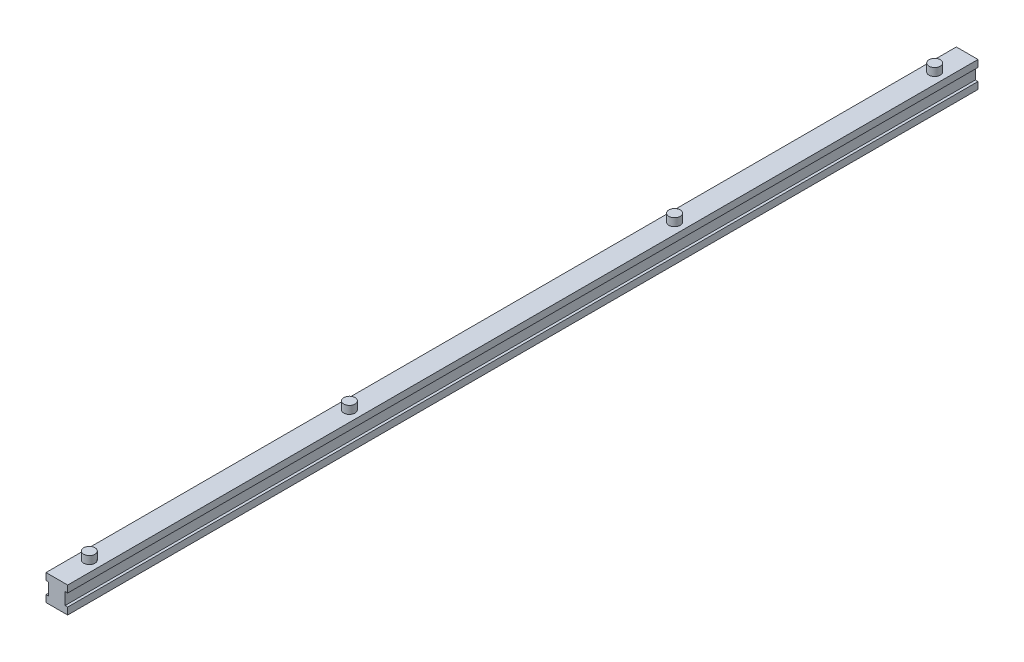
ISO-10303-21;
HEADER;
FILE_DESCRIPTION(('STEP AP214'),'2;1');
FILE_NAME('part.step','',(''),(''),'','','');
FILE_SCHEMA(('AUTOMOTIVE_DESIGN { 1 0 10303 214 1 1 1 1 }'));
ENDSEC;
DATA;
#1=APPLICATION_CONTEXT('core data for automotive mechanical design processes');
#2=APPLICATION_PROTOCOL_DEFINITION('international standard','automotive_design',2000,#1);
#3=PRODUCT_CONTEXT('',#1,'mechanical');
#4=PRODUCT('Part','Part','',(#3));
#5=PRODUCT_RELATED_PRODUCT_CATEGORY('part','',(#4));
#6=PRODUCT_DEFINITION_FORMATION('','',#4);
#7=PRODUCT_DEFINITION_CONTEXT('part definition',#1,'design');
#8=PRODUCT_DEFINITION('design','',#6,#7);
#9=PRODUCT_DEFINITION_SHAPE('','',#8);
#10=(LENGTH_UNIT() NAMED_UNIT(*) SI_UNIT(.MILLI.,.METRE.));
#11=(NAMED_UNIT(*) PLANE_ANGLE_UNIT() SI_UNIT($,.RADIAN.));
#12=(NAMED_UNIT(*) SI_UNIT($,.STERADIAN.) SOLID_ANGLE_UNIT());
#13=UNCERTAINTY_MEASURE_WITH_UNIT(LENGTH_MEASURE(1.E-05),#10,'distance_accuracy_value','');
#14=(GEOMETRIC_REPRESENTATION_CONTEXT(3) GLOBAL_UNCERTAINTY_ASSIGNED_CONTEXT((#13)) GLOBAL_UNIT_ASSIGNED_CONTEXT((#10,
#11,#12)) REPRESENTATION_CONTEXT('',''));
#15=CARTESIAN_POINT('',(0.,0.,0.));
#16=DIRECTION('',(0.,0.,1.));
#17=DIRECTION('',(1.,0.,0.));
#18=AXIS2_PLACEMENT_3D('',#15,#16,#17);
#19=CARTESIAN_POINT('',(0.,0.8,0.));
#20=DIRECTION('',(0.,1.,0.));
#21=DIRECTION('',(0.,0.,1.));
#22=AXIS2_PLACEMENT_3D('',#19,#20,#21);
#23=PLANE('',#22);
#24=DIRECTION('',(0.,0.,1.));
#25=VECTOR('',#24,1.);
#26=CARTESIAN_POINT('',(-0.95,0.8,52.5));
#27=LINE('',#26,#25);
#28=CARTESIAN_POINT('',(-0.95,0.8,-52.5));
#29=VERTEX_POINT('',#28);
#30=CARTESIAN_POINT('',(-0.95,0.8,52.5));
#31=VERTEX_POINT('',#30);
#32=EDGE_CURVE('E48',#29,#31,#27,.T.);
#33=ORIENTED_EDGE('',*,*,#32,.F.);
#34=DIRECTION('',(-1.,0.,0.));
#35=VECTOR('',#34,1.);
#36=CARTESIAN_POINT('',(1.25,0.8,-52.5));
#37=LINE('',#36,#35);
#38=CARTESIAN_POINT('',(-1.25,0.8,-52.5));
#39=VERTEX_POINT('',#38);
#40=EDGE_CURVE('E182',#29,#39,#37,.T.);
#41=ORIENTED_EDGE('',*,*,#40,.T.);
#42=DIRECTION('',(0.,0.,1.));
#43=VECTOR('',#42,1.);
#44=CARTESIAN_POINT('',(-1.25,0.8,52.5));
#45=LINE('',#44,#43);
#46=CARTESIAN_POINT('',(-1.25,0.8,52.5));
#47=VERTEX_POINT('',#46);
#48=EDGE_CURVE('E173',#39,#47,#45,.T.);
#49=ORIENTED_EDGE('',*,*,#48,.T.);
#50=DIRECTION('',(1.,0.,0.));
#51=VECTOR('',#50,1.);
#52=CARTESIAN_POINT('',(1.25,0.8,52.5));
#53=LINE('',#52,#51);
#54=EDGE_CURVE('E178',#47,#31,#53,.T.);
#55=ORIENTED_EDGE('',*,*,#54,.T.);
#56=EDGE_LOOP('',(#33,#41,#49,#55));
#57=FACE_BOUND('',#56,.T.);
#58=ADVANCED_FACE('F33',(#57),#23,.T.);
#59=CARTESIAN_POINT('',(-1.25,0.8,52.5));
#60=DIRECTION('',(1.,0.,0.));
#61=DIRECTION('',(0.,0.,-1.));
#62=AXIS2_PLACEMENT_3D('',#59,#60,#61);
#63=PLANE('',#62);
#64=DIRECTION('',(0.,0.,1.));
#65=VECTOR('',#64,1.);
#66=CARTESIAN_POINT('',(-1.25,0.,52.5));
#67=LINE('',#66,#65);
#68=CARTESIAN_POINT('',(-1.25,0.,-52.5));
#69=VERTEX_POINT('',#68);
#70=CARTESIAN_POINT('',(-1.25,0.,52.5));
#71=VERTEX_POINT('',#70);
#72=EDGE_CURVE('E172',#69,#71,#67,.T.);
#73=ORIENTED_EDGE('',*,*,#72,.T.);
#74=DIRECTION('',(0.,-1.,0.));
#75=VECTOR('',#74,1.);
#76=CARTESIAN_POINT('',(-1.25,0.8,52.5));
#77=LINE('',#76,#75);
#78=EDGE_CURVE('E11',#47,#71,#77,.T.);
#79=ORIENTED_EDGE('',*,*,#78,.F.);
#80=ORIENTED_EDGE('',*,*,#48,.F.);
#81=DIRECTION('',(0.,-1.,0.));
#82=VECTOR('',#81,1.);
#83=CARTESIAN_POINT('',(-1.25,0.8,-52.5));
#84=LINE('',#83,#82);
#85=EDGE_CURVE('E185',#39,#69,#84,.T.);
#86=ORIENTED_EDGE('',*,*,#85,.T.);
#87=EDGE_LOOP('',(#73,#79,#80,#86));
#88=FACE_BOUND('',#87,.T.);
#89=ADVANCED_FACE('F35',(#88),#63,.F.);
#90=CARTESIAN_POINT('',(1.25,0.8,52.5));
#91=DIRECTION('',(0.,0.,-1.));
#92=DIRECTION('',(-1.,0.,0.));
#93=AXIS2_PLACEMENT_3D('',#90,#91,#92);
#94=PLANE('',#93);
#95=DIRECTION('',(1.,0.,0.));
#96=VECTOR('',#95,1.);
#97=CARTESIAN_POINT('',(1.25,0.,52.5));
#98=LINE('',#97,#96);
#99=CARTESIAN_POINT('',(1.25,0.,52.5));
#100=VERTEX_POINT('',#99);
#101=EDGE_CURVE('E188',#71,#100,#98,.T.);
#102=ORIENTED_EDGE('',*,*,#101,.T.);
#103=DIRECTION('',(0.,-1.,0.));
#104=VECTOR('',#103,1.);
#105=CARTESIAN_POINT('',(1.25,0.8,52.5));
#106=LINE('',#105,#104);
#107=CARTESIAN_POINT('',(1.25,0.8,52.5));
#108=VERTEX_POINT('',#107);
#109=EDGE_CURVE('E41',#108,#100,#106,.T.);
#110=ORIENTED_EDGE('',*,*,#109,.F.);
#111=CARTESIAN_POINT('',(0.95,0.8,52.5));
#112=VERTEX_POINT('',#111);
#113=EDGE_CURVE('E176',#112,#108,#53,.T.);
#114=ORIENTED_EDGE('',*,*,#113,.F.);
#115=DIRECTION('',(0.,-1.,0.));
#116=VECTOR('',#115,1.);
#117=CARTESIAN_POINT('',(0.95,2.2,52.5));
#118=LINE('',#117,#116);
#119=CARTESIAN_POINT('',(0.95,2.2,52.5));
#120=VERTEX_POINT('',#119);
#121=EDGE_CURVE('E166',#120,#112,#118,.T.);
#122=ORIENTED_EDGE('',*,*,#121,.F.);
#123=DIRECTION('',(1.,0.,0.));
#124=VECTOR('',#123,1.);
#125=CARTESIAN_POINT('',(-1.25,2.2,52.5));
#126=LINE('',#125,#124);
#127=CARTESIAN_POINT('',(1.25,2.2,52.5));
#128=VERTEX_POINT('',#127);
#129=EDGE_CURVE('E145',#120,#128,#126,.T.);
#130=ORIENTED_EDGE('',*,*,#129,.T.);
#131=DIRECTION('',(0.,-1.,0.));
#132=VECTOR('',#131,1.);
#133=CARTESIAN_POINT('',(1.25,3.,52.5));
#134=LINE('',#133,#132);
#135=CARTESIAN_POINT('',(1.25,3.,52.5));
#136=VERTEX_POINT('',#135);
#137=EDGE_CURVE('E126',#136,#128,#134,.T.);
#138=ORIENTED_EDGE('',*,*,#137,.F.);
#139=DIRECTION('',(1.,0.,0.));
#140=VECTOR('',#139,1.);
#141=CARTESIAN_POINT('',(-1.25,3.,52.5));
#142=LINE('',#141,#140);
#143=CARTESIAN_POINT('',(-1.25,3.,52.5));
#144=VERTEX_POINT('',#143);
#145=EDGE_CURVE('E132',#144,#136,#142,.T.);
#146=ORIENTED_EDGE('',*,*,#145,.F.);
#147=DIRECTION('',(0.,-1.,0.));
#148=VECTOR('',#147,1.);
#149=CARTESIAN_POINT('',(-1.25,3.,52.5));
#150=LINE('',#149,#148);
#151=CARTESIAN_POINT('',(-1.25,2.2,52.5));
#152=VERTEX_POINT('',#151);
#153=EDGE_CURVE('E236',#144,#152,#150,.T.);
#154=ORIENTED_EDGE('',*,*,#153,.T.);
#155=CARTESIAN_POINT('',(-0.95,2.2,52.5));
#156=VERTEX_POINT('',#155);
#157=EDGE_CURVE('E231',#152,#156,#126,.T.);
#158=ORIENTED_EDGE('',*,*,#157,.T.);
#159=DIRECTION('',(0.,-1.,0.));
#160=VECTOR('',#159,1.);
#161=CARTESIAN_POINT('',(-0.95,2.2,52.5));
#162=LINE('',#161,#160);
#163=EDGE_CURVE('E169',#156,#31,#162,.T.);
#164=ORIENTED_EDGE('',*,*,#163,.T.);
#165=ORIENTED_EDGE('',*,*,#54,.F.);
#166=ORIENTED_EDGE('',*,*,#78,.T.);
#167=EDGE_LOOP('',(#102,#110,#114,#122,#130,#138,#146,#154,#158,#164,#165,#166));
#168=FACE_BOUND('',#167,.T.);
#169=ADVANCED_FACE('F143',(#168),#94,.F.);
#170=CARTESIAN_POINT('',(1.25,0.8,52.5));
#171=DIRECTION('',(-1.,0.,0.));
#172=DIRECTION('',(0.,0.,1.));
#173=AXIS2_PLACEMENT_3D('',#170,#171,#172);
#174=PLANE('',#173);
#175=DIRECTION('',(0.,0.,-1.));
#176=VECTOR('',#175,1.);
#177=CARTESIAN_POINT('',(1.25,0.,52.5));
#178=LINE('',#177,#176);
#179=CARTESIAN_POINT('',(1.25,0.,-52.5));
#180=VERTEX_POINT('',#179);
#181=EDGE_CURVE('E190',#100,#180,#178,.T.);
#182=ORIENTED_EDGE('',*,*,#181,.T.);
#183=DIRECTION('',(0.,-1.,0.));
#184=VECTOR('',#183,1.);
#185=CARTESIAN_POINT('',(1.25,0.8,-52.5));
#186=LINE('',#185,#184);
#187=CARTESIAN_POINT('',(1.25,0.8,-52.5));
#188=VERTEX_POINT('',#187);
#189=EDGE_CURVE('E195',#188,#180,#186,.T.);
#190=ORIENTED_EDGE('',*,*,#189,.F.);
#191=DIRECTION('',(0.,0.,-1.));
#192=VECTOR('',#191,1.);
#193=CARTESIAN_POINT('',(1.25,0.8,52.5));
#194=LINE('',#193,#192);
#195=EDGE_CURVE('E180',#108,#188,#194,.T.);
#196=ORIENTED_EDGE('',*,*,#195,.F.);
#197=ORIENTED_EDGE('',*,*,#109,.T.);
#198=EDGE_LOOP('',(#182,#190,#196,#197));
#199=FACE_BOUND('',#198,.T.);
#200=ADVANCED_FACE('F202',(#199),#174,.F.);
#201=CARTESIAN_POINT('',(1.25,0.8,-52.5));
#202=DIRECTION('',(0.,0.,1.));
#203=DIRECTION('',(1.,0.,0.));
#204=AXIS2_PLACEMENT_3D('',#201,#202,#203);
#205=PLANE('',#204);
#206=DIRECTION('',(-1.,0.,0.));
#207=VECTOR('',#206,1.);
#208=CARTESIAN_POINT('',(1.25,0.,-52.5));
#209=LINE('',#208,#207);
#210=EDGE_CURVE('E177',#180,#69,#209,.T.);
#211=ORIENTED_EDGE('',*,*,#210,.T.);
#212=ORIENTED_EDGE('',*,*,#85,.F.);
#213=ORIENTED_EDGE('',*,*,#40,.F.);
#214=DIRECTION('',(0.,-1.,0.));
#215=VECTOR('',#214,1.);
#216=CARTESIAN_POINT('',(-0.95,2.2,-52.5));
#217=LINE('',#216,#215);
#218=CARTESIAN_POINT('',(-0.95,2.2,-52.5));
#219=VERTEX_POINT('',#218);
#220=EDGE_CURVE('E158',#219,#29,#217,.T.);
#221=ORIENTED_EDGE('',*,*,#220,.F.);
#222=DIRECTION('',(-1.,0.,0.));
#223=VECTOR('',#222,1.);
#224=CARTESIAN_POINT('',(1.25,2.2,-52.5));
#225=LINE('',#224,#223);
#226=CARTESIAN_POINT('',(-1.25,2.2,-52.5));
#227=VERTEX_POINT('',#226);
#228=EDGE_CURVE('E223',#219,#227,#225,.T.);
#229=ORIENTED_EDGE('',*,*,#228,.T.);
#230=DIRECTION('',(0.,-1.,0.));
#231=VECTOR('',#230,1.);
#232=CARTESIAN_POINT('',(-1.25,3.,-52.5));
#233=LINE('',#232,#231);
#234=CARTESIAN_POINT('',(-1.25,3.,-52.5));
#235=VERTEX_POINT('',#234);
#236=EDGE_CURVE('E149',#235,#227,#233,.T.);
#237=ORIENTED_EDGE('',*,*,#236,.F.);
#238=DIRECTION('',(-1.,0.,0.));
#239=VECTOR('',#238,1.);
#240=CARTESIAN_POINT('',(1.25,3.,-52.5));
#241=LINE('',#240,#239);
#242=CARTESIAN_POINT('',(1.25,3.,-52.5));
#243=VERTEX_POINT('',#242);
#244=EDGE_CURVE('E131',#243,#235,#241,.T.);
#245=ORIENTED_EDGE('',*,*,#244,.F.);
#246=DIRECTION('',(0.,-1.,0.));
#247=VECTOR('',#246,1.);
#248=CARTESIAN_POINT('',(1.25,3.,-52.5));
#249=LINE('',#248,#247);
#250=CARTESIAN_POINT('',(1.25,2.2,-52.5));
#251=VERTEX_POINT('',#250);
#252=EDGE_CURVE('E128',#243,#251,#249,.T.);
#253=ORIENTED_EDGE('',*,*,#252,.T.);
#254=CARTESIAN_POINT('',(0.95,2.2,-52.5));
#255=VERTEX_POINT('',#254);
#256=EDGE_CURVE('E227',#251,#255,#225,.T.);
#257=ORIENTED_EDGE('',*,*,#256,.T.);
#258=DIRECTION('',(0.,-1.,0.));
#259=VECTOR('',#258,1.);
#260=CARTESIAN_POINT('',(0.95,2.2,-52.5));
#261=LINE('',#260,#259);
#262=CARTESIAN_POINT('',(0.95,0.8,-52.5));
#263=VERTEX_POINT('',#262);
#264=EDGE_CURVE('E163',#255,#263,#261,.T.);
#265=ORIENTED_EDGE('',*,*,#264,.T.);
#266=EDGE_CURVE('E183',#188,#263,#37,.T.);
#267=ORIENTED_EDGE('',*,*,#266,.F.);
#268=ORIENTED_EDGE('',*,*,#189,.T.);
#269=EDGE_LOOP('',(#211,#212,#213,#221,#229,#237,#245,#253,#257,#265,#267,#268));
#270=FACE_BOUND('',#269,.T.);
#271=ADVANCED_FACE('F210',(#270),#205,.F.);
#272=DIRECTION('',(0.,0.,-1.));
#273=VECTOR('',#272,1.);
#274=CARTESIAN_POINT('',(0.95,0.8,52.5));
#275=LINE('',#274,#273);
#276=EDGE_CURVE('E56',#112,#263,#275,.T.);
#277=ORIENTED_EDGE('',*,*,#276,.F.);
#278=ORIENTED_EDGE('',*,*,#113,.T.);
#279=ORIENTED_EDGE('',*,*,#195,.T.);
#280=ORIENTED_EDGE('',*,*,#266,.T.);
#281=EDGE_LOOP('',(#277,#278,#279,#280));
#282=FACE_BOUND('',#281,.T.);
#283=ADVANCED_FACE('F300',(#282),#23,.T.);
#284=CARTESIAN_POINT('',(0.,0.,0.));
#285=DIRECTION('',(0.,1.,0.));
#286=DIRECTION('',(0.,0.,1.));
#287=AXIS2_PLACEMENT_3D('',#284,#285,#286);
#288=PLANE('',#287);
#289=ORIENTED_EDGE('',*,*,#72,.F.);
#290=ORIENTED_EDGE('',*,*,#210,.F.);
#291=ORIENTED_EDGE('',*,*,#181,.F.);
#292=ORIENTED_EDGE('',*,*,#101,.F.);
#293=EDGE_LOOP('',(#289,#290,#291,#292));
#294=FACE_BOUND('',#293,.T.);
#295=ADVANCED_FACE('F207',(#294),#288,.F.);
#296=CARTESIAN_POINT('',(-0.95,2.2,52.5));
#297=DIRECTION('',(1.,0.,0.));
#298=DIRECTION('',(0.,0.,-1.));
#299=AXIS2_PLACEMENT_3D('',#296,#297,#298);
#300=PLANE('',#299);
#301=ORIENTED_EDGE('',*,*,#32,.T.);
#302=ORIENTED_EDGE('',*,*,#163,.F.);
#303=DIRECTION('',(0.,0.,1.));
#304=VECTOR('',#303,1.);
#305=CARTESIAN_POINT('',(-0.95,2.2,52.5));
#306=LINE('',#305,#304);
#307=EDGE_CURVE('E153',#219,#156,#306,.T.);
#308=ORIENTED_EDGE('',*,*,#307,.F.);
#309=ORIENTED_EDGE('',*,*,#220,.T.);
#310=EDGE_LOOP('',(#301,#302,#308,#309));
#311=FACE_BOUND('',#310,.T.);
#312=ADVANCED_FACE('F217',(#311),#300,.F.);
#313=CARTESIAN_POINT('',(0.95,2.2,52.5));
#314=DIRECTION('',(-1.,0.,0.));
#315=DIRECTION('',(0.,0.,1.));
#316=AXIS2_PLACEMENT_3D('',#313,#314,#315);
#317=PLANE('',#316);
#318=ORIENTED_EDGE('',*,*,#276,.T.);
#319=ORIENTED_EDGE('',*,*,#264,.F.);
#320=DIRECTION('',(0.,0.,-1.));
#321=VECTOR('',#320,1.);
#322=CARTESIAN_POINT('',(0.95,2.2,52.5));
#323=LINE('',#322,#321);
#324=EDGE_CURVE('E156',#120,#255,#323,.T.);
#325=ORIENTED_EDGE('',*,*,#324,.F.);
#326=ORIENTED_EDGE('',*,*,#121,.T.);
#327=EDGE_LOOP('',(#318,#319,#325,#326));
#328=FACE_BOUND('',#327,.T.);
#329=ADVANCED_FACE('F365',(#328),#317,.F.);
#330=CARTESIAN_POINT('',(0.,2.2,0.));
#331=DIRECTION('',(0.,1.,0.));
#332=DIRECTION('',(0.,0.,1.));
#333=AXIS2_PLACEMENT_3D('',#330,#331,#332);
#334=PLANE('',#333);
#335=ORIENTED_EDGE('',*,*,#228,.F.);
#336=ORIENTED_EDGE('',*,*,#307,.T.);
#337=ORIENTED_EDGE('',*,*,#157,.F.);
#338=DIRECTION('',(0.,0.,1.));
#339=VECTOR('',#338,1.);
#340=CARTESIAN_POINT('',(-1.25,2.2,-52.5));
#341=LINE('',#340,#339);
#342=EDGE_CURVE('E141',#227,#152,#341,.T.);
#343=ORIENTED_EDGE('',*,*,#342,.F.);
#344=EDGE_LOOP('',(#335,#336,#337,#343));
#345=FACE_BOUND('',#344,.T.);
#346=ADVANCED_FACE('F224',(#345),#334,.F.);
#347=ORIENTED_EDGE('',*,*,#129,.F.);
#348=ORIENTED_EDGE('',*,*,#324,.T.);
#349=ORIENTED_EDGE('',*,*,#256,.F.);
#350=DIRECTION('',(0.,0.,-1.));
#351=VECTOR('',#350,1.);
#352=CARTESIAN_POINT('',(1.25,2.2,52.5));
#353=LINE('',#352,#351);
#354=EDGE_CURVE('E228',#128,#251,#353,.T.);
#355=ORIENTED_EDGE('',*,*,#354,.F.);
#356=EDGE_LOOP('',(#347,#348,#349,#355));
#357=FACE_BOUND('',#356,.T.);
#358=ADVANCED_FACE('F381',(#357),#334,.F.);
#359=CARTESIAN_POINT('',(1.25,3.,52.5));
#360=DIRECTION('',(-1.,0.,0.));
#361=DIRECTION('',(0.,0.,1.));
#362=AXIS2_PLACEMENT_3D('',#359,#360,#361);
#363=PLANE('',#362);
#364=ORIENTED_EDGE('',*,*,#354,.T.);
#365=ORIENTED_EDGE('',*,*,#252,.F.);
#366=DIRECTION('',(0.,0.,-1.));
#367=VECTOR('',#366,1.);
#368=CARTESIAN_POINT('',(1.25,3.,52.5));
#369=LINE('',#368,#367);
#370=EDGE_CURVE('E122',#136,#243,#369,.T.);
#371=ORIENTED_EDGE('',*,*,#370,.F.);
#372=ORIENTED_EDGE('',*,*,#137,.T.);
#373=EDGE_LOOP('',(#364,#365,#371,#372));
#374=FACE_BOUND('',#373,.T.);
#375=ADVANCED_FACE('F124',(#374),#363,.F.);
#376=CARTESIAN_POINT('',(-1.25,3.,-52.5));
#377=DIRECTION('',(1.,0.,0.));
#378=DIRECTION('',(0.,0.,-1.));
#379=AXIS2_PLACEMENT_3D('',#376,#377,#378);
#380=PLANE('',#379);
#381=ORIENTED_EDGE('',*,*,#342,.T.);
#382=ORIENTED_EDGE('',*,*,#153,.F.);
#383=DIRECTION('',(0.,0.,1.));
#384=VECTOR('',#383,1.);
#385=CARTESIAN_POINT('',(-1.25,3.,-52.5));
#386=LINE('',#385,#384);
#387=EDGE_CURVE('E137',#235,#144,#386,.T.);
#388=ORIENTED_EDGE('',*,*,#387,.F.);
#389=ORIENTED_EDGE('',*,*,#236,.T.);
#390=EDGE_LOOP('',(#381,#382,#388,#389));
#391=FACE_BOUND('',#390,.T.);
#392=ADVANCED_FACE('F238',(#391),#380,.F.);
#393=CARTESIAN_POINT('',(0.,3.,0.));
#394=DIRECTION('',(0.,1.,0.));
#395=DIRECTION('',(0.,0.,1.));
#396=AXIS2_PLACEMENT_3D('',#393,#394,#395);
#397=PLANE('',#396);
#398=CARTESIAN_POINT('',(0.,3.,48.75));
#399=DIRECTION('',(0.,1.,0.));
#400=DIRECTION('',(0.,0.,1.));
#401=AXIS2_PLACEMENT_3D('',#398,#399,#400);
#402=CIRCLE('',#401,0.65);
#403=CARTESIAN_POINT('',(0.,3.,49.4));
#404=VERTEX_POINT('',#403);
#405=EDGE_CURVE('E264',#404,#404,#402,.T.);
#406=ORIENTED_EDGE('',*,*,#405,.F.);
#407=EDGE_LOOP('',(#406));
#408=FACE_BOUND('',#407,.T.);
#409=CARTESIAN_POINT('',(0.,3.,-48.75));
#410=DIRECTION('',(0.,1.,0.));
#411=DIRECTION('',(0.,0.,1.));
#412=AXIS2_PLACEMENT_3D('',#409,#410,#411);
#413=CIRCLE('',#412,0.65);
#414=CARTESIAN_POINT('',(0.,3.,-48.1));
#415=VERTEX_POINT('',#414);
#416=EDGE_CURVE('E258',#415,#415,#413,.T.);
#417=ORIENTED_EDGE('',*,*,#416,.F.);
#418=EDGE_LOOP('',(#417));
#419=FACE_BOUND('',#418,.T.);
#420=CARTESIAN_POINT('',(0.,3.,18.75));
#421=DIRECTION('',(0.,1.,0.));
#422=DIRECTION('',(0.,0.,1.));
#423=AXIS2_PLACEMENT_3D('',#420,#421,#422);
#424=CIRCLE('',#423,0.650000000000001);
#425=CARTESIAN_POINT('',(0.,3.,19.4));
#426=VERTEX_POINT('',#425);
#427=EDGE_CURVE('E252',#426,#426,#424,.T.);
#428=ORIENTED_EDGE('',*,*,#427,.F.);
#429=EDGE_LOOP('',(#428));
#430=FACE_BOUND('',#429,.T.);
#431=CARTESIAN_POINT('',(0.,3.,-18.75));
#432=DIRECTION('',(0.,1.,0.));
#433=DIRECTION('',(0.,0.,1.));
#434=AXIS2_PLACEMENT_3D('',#431,#432,#433);
#435=CIRCLE('',#434,0.650000000000001);
#436=CARTESIAN_POINT('',(0.,3.,-18.1));
#437=VERTEX_POINT('',#436);
#438=EDGE_CURVE('E244',#437,#437,#435,.T.);
#439=ORIENTED_EDGE('',*,*,#438,.F.);
#440=EDGE_LOOP('',(#439));
#441=FACE_BOUND('',#440,.T.);
#442=ORIENTED_EDGE('',*,*,#145,.T.);
#443=ORIENTED_EDGE('',*,*,#370,.T.);
#444=ORIENTED_EDGE('',*,*,#244,.T.);
#445=ORIENTED_EDGE('',*,*,#387,.T.);
#446=EDGE_LOOP('',(#442,#443,#444,#445));
#447=FACE_BOUND('',#446,.T.);
#448=ADVANCED_FACE('F135',(#408,#419,#430,#441,#447),#397,.T.);
#449=CARTESIAN_POINT('',(0.,3.9,-18.75));
#450=DIRECTION('',(0.,-1.,0.));
#451=DIRECTION('',(0.,0.,-1.));
#452=AXIS2_PLACEMENT_3D('',#449,#450,#451);
#453=CYLINDRICAL_SURFACE('',#452,0.650000000000001);
#454=CARTESIAN_POINT('',(0.,3.9,-18.75));
#455=DIRECTION('',(0.,1.,0.));
#456=DIRECTION('',(0.,0.,1.));
#457=AXIS2_PLACEMENT_3D('',#454,#455,#456);
#458=CIRCLE('',#457,0.650000000000001);
#459=CARTESIAN_POINT('',(0.,3.9,-18.1));
#460=VERTEX_POINT('',#459);
#461=EDGE_CURVE('E242',#460,#460,#458,.T.);
#462=ORIENTED_EDGE('',*,*,#461,.F.);
#463=EDGE_LOOP('',(#462));
#464=FACE_BOUND('',#463,.T.);
#465=ORIENTED_EDGE('',*,*,#438,.T.);
#466=EDGE_LOOP('',(#465));
#467=FACE_BOUND('',#466,.T.);
#468=ADVANCED_FACE('F281',(#464,#467),#453,.T.);
#469=CARTESIAN_POINT('',(0.,3.9,-18.75));
#470=DIRECTION('',(0.,1.,0.));
#471=DIRECTION('',(0.,0.,1.));
#472=AXIS2_PLACEMENT_3D('',#469,#470,#471);
#473=PLANE('',#472);
#474=ORIENTED_EDGE('',*,*,#461,.T.);
#475=EDGE_LOOP('',(#474));
#476=FACE_BOUND('',#475,.T.);
#477=ADVANCED_FACE('F290',(#476),#473,.T.);
#478=CARTESIAN_POINT('',(0.,3.9,18.75));
#479=DIRECTION('',(0.,-1.,0.));
#480=DIRECTION('',(0.,0.,-1.));
#481=AXIS2_PLACEMENT_3D('',#478,#479,#480);
#482=CYLINDRICAL_SURFACE('',#481,0.650000000000001);
#483=CARTESIAN_POINT('',(0.,3.9,18.75));
#484=DIRECTION('',(0.,1.,0.));
#485=DIRECTION('',(0.,0.,1.));
#486=AXIS2_PLACEMENT_3D('',#483,#484,#485);
#487=CIRCLE('',#486,0.650000000000001);
#488=CARTESIAN_POINT('',(0.,3.9,19.4));
#489=VERTEX_POINT('',#488);
#490=EDGE_CURVE('E249',#489,#489,#487,.T.);
#491=ORIENTED_EDGE('',*,*,#490,.F.);
#492=EDGE_LOOP('',(#491));
#493=FACE_BOUND('',#492,.T.);
#494=ORIENTED_EDGE('',*,*,#427,.T.);
#495=EDGE_LOOP('',(#494));
#496=FACE_BOUND('',#495,.T.);
#497=ADVANCED_FACE('F296',(#493,#496),#482,.T.);
#498=CARTESIAN_POINT('',(0.,3.9,18.75));
#499=DIRECTION('',(0.,1.,0.));
#500=DIRECTION('',(0.,0.,1.));
#501=AXIS2_PLACEMENT_3D('',#498,#499,#500);
#502=PLANE('',#501);
#503=ORIENTED_EDGE('',*,*,#490,.T.);
#504=EDGE_LOOP('',(#503));
#505=FACE_BOUND('',#504,.T.);
#506=ADVANCED_FACE('F430',(#505),#502,.T.);
#507=CARTESIAN_POINT('',(0.,3.9,-48.75));
#508=DIRECTION('',(0.,-1.,0.));
#509=DIRECTION('',(0.,0.,-1.));
#510=AXIS2_PLACEMENT_3D('',#507,#508,#509);
#511=CYLINDRICAL_SURFACE('',#510,0.65);
#512=CARTESIAN_POINT('',(0.,3.9,-48.75));
#513=DIRECTION('',(0.,1.,0.));
#514=DIRECTION('',(0.,0.,1.));
#515=AXIS2_PLACEMENT_3D('',#512,#513,#514);
#516=CIRCLE('',#515,0.65);
#517=CARTESIAN_POINT('',(0.,3.9,-48.1));
#518=VERTEX_POINT('',#517);
#519=EDGE_CURVE('E255',#518,#518,#516,.T.);
#520=ORIENTED_EDGE('',*,*,#519,.F.);
#521=EDGE_LOOP('',(#520));
#522=FACE_BOUND('',#521,.T.);
#523=ORIENTED_EDGE('',*,*,#416,.T.);
#524=EDGE_LOOP('',(#523));
#525=FACE_BOUND('',#524,.T.);
#526=ADVANCED_FACE('F440',(#522,#525),#511,.T.);
#527=CARTESIAN_POINT('',(0.,3.9,-48.75));
#528=DIRECTION('',(0.,1.,0.));
#529=DIRECTION('',(0.,0.,1.));
#530=AXIS2_PLACEMENT_3D('',#527,#528,#529);
#531=PLANE('',#530);
#532=ORIENTED_EDGE('',*,*,#519,.T.);
#533=EDGE_LOOP('',(#532));
#534=FACE_BOUND('',#533,.T.);
#535=ADVANCED_FACE('F275',(#534),#531,.T.);
#536=CARTESIAN_POINT('',(0.,3.9,48.75));
#537=DIRECTION('',(0.,-1.,0.));
#538=DIRECTION('',(0.,0.,-1.));
#539=AXIS2_PLACEMENT_3D('',#536,#537,#538);
#540=CYLINDRICAL_SURFACE('',#539,0.65);
#541=CARTESIAN_POINT('',(0.,3.9,48.75));
#542=DIRECTION('',(0.,1.,0.));
#543=DIRECTION('',(0.,0.,1.));
#544=AXIS2_PLACEMENT_3D('',#541,#542,#543);
#545=CIRCLE('',#544,0.65);
#546=CARTESIAN_POINT('',(0.,3.9,49.4));
#547=VERTEX_POINT('',#546);
#548=EDGE_CURVE('E261',#547,#547,#545,.T.);
#549=ORIENTED_EDGE('',*,*,#548,.F.);
#550=EDGE_LOOP('',(#549));
#551=FACE_BOUND('',#550,.T.);
#552=ORIENTED_EDGE('',*,*,#405,.T.);
#553=EDGE_LOOP('',(#552));
#554=FACE_BOUND('',#553,.T.);
#555=ADVANCED_FACE('F272',(#551,#554),#540,.T.);
#556=CARTESIAN_POINT('',(0.,3.9,48.75));
#557=DIRECTION('',(0.,1.,0.));
#558=DIRECTION('',(0.,0.,1.));
#559=AXIS2_PLACEMENT_3D('',#556,#557,#558);
#560=PLANE('',#559);
#561=ORIENTED_EDGE('',*,*,#548,.T.);
#562=EDGE_LOOP('',(#561));
#563=FACE_BOUND('',#562,.T.);
#564=ADVANCED_FACE('F270',(#563),#560,.T.);
#565=CLOSED_SHELL('',(#58,#89,#169,#200,#271,#283,#295,#312,#329,#346,#358,#375,#392,#448,#468,
#477,#497,#506,#526,#535,#555,#564));
#566=MANIFOLD_SOLID_BREP('B2',#565);
#567=ADVANCED_BREP_SHAPE_REPRESENTATION('',(#18,#566),#14);
#568=SHAPE_DEFINITION_REPRESENTATION(#9,#567);
ENDSEC;
END-ISO-10303-21;
